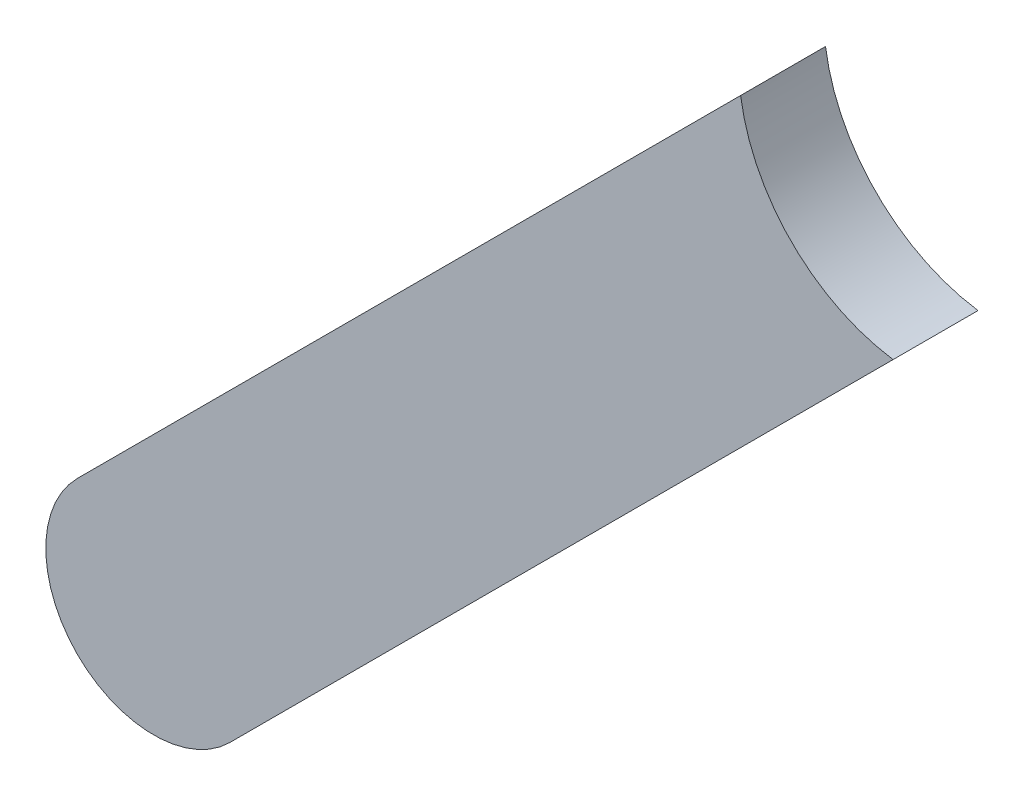
ISO-10303-21;
HEADER;
FILE_DESCRIPTION(('STEP AP214'),'2;1');
FILE_NAME('part.step','',(''),(''),'','','');
FILE_SCHEMA(('AUTOMOTIVE_DESIGN { 1 0 10303 214 1 1 1 1 }'));
ENDSEC;
DATA;
#1=APPLICATION_CONTEXT('core data for automotive mechanical design processes');
#2=APPLICATION_PROTOCOL_DEFINITION('international standard','automotive_design',2000,#1);
#3=PRODUCT_CONTEXT('',#1,'mechanical');
#4=PRODUCT('Part','Part','',(#3));
#5=PRODUCT_RELATED_PRODUCT_CATEGORY('part','',(#4));
#6=PRODUCT_DEFINITION_FORMATION('','',#4);
#7=PRODUCT_DEFINITION_CONTEXT('part definition',#1,'design');
#8=PRODUCT_DEFINITION('design','',#6,#7);
#9=PRODUCT_DEFINITION_SHAPE('','',#8);
#10=(LENGTH_UNIT() NAMED_UNIT(*) SI_UNIT(.MILLI.,.METRE.));
#11=(NAMED_UNIT(*) PLANE_ANGLE_UNIT() SI_UNIT($,.RADIAN.));
#12=(NAMED_UNIT(*) SI_UNIT($,.STERADIAN.) SOLID_ANGLE_UNIT());
#13=UNCERTAINTY_MEASURE_WITH_UNIT(LENGTH_MEASURE(1.E-05),#10,'distance_accuracy_value','');
#14=(GEOMETRIC_REPRESENTATION_CONTEXT(3) GLOBAL_UNCERTAINTY_ASSIGNED_CONTEXT((#13)) GLOBAL_UNIT_ASSIGNED_CONTEXT((#10,
#11,#12)) REPRESENTATION_CONTEXT('',''));
#15=CARTESIAN_POINT('',(0.,0.,0.));
#16=DIRECTION('',(0.,0.,1.));
#17=DIRECTION('',(1.,0.,0.));
#18=AXIS2_PLACEMENT_3D('',#15,#16,#17);
#19=CARTESIAN_POINT('',(132.48820594,53.64299406,0.));
#20=DIRECTION('',(-0.70710678118655,0.707106781186545,0.));
#21=DIRECTION('',(0.707106781186545,0.70710678118655,0.));
#22=AXIS2_PLACEMENT_3D('',#19,#20,#21);
#23=PLANE('',#22);
#24=DIRECTION('',(0.707106781186545,0.70710678118655,0.));
#25=VECTOR('',#24,1.);
#26=CARTESIAN_POINT('',(132.48820594,53.64299406,0.1999996));
#27=LINE('',#26,#25);
#28=CARTESIAN_POINT('',(132.48820594,53.64299406,0.1999996));
#29=VERTEX_POINT('',#28);
#30=CARTESIAN_POINT('',(134.05066116455,55.2054492845497,0.1999996));
#31=VERTEX_POINT('',#30);
#32=EDGE_CURVE('E11',#29,#31,#27,.T.);
#33=ORIENTED_EDGE('',*,*,#32,.F.);
#34=DIRECTION('',(0.,0.,1.));
#35=VECTOR('',#34,1.);
#36=CARTESIAN_POINT('',(132.48820594,53.64299406,0.));
#37=LINE('',#36,#35);
#38=CARTESIAN_POINT('',(132.48820594,53.64299406,0.));
#39=VERTEX_POINT('',#38);
#40=EDGE_CURVE('E24',#39,#29,#37,.T.);
#41=ORIENTED_EDGE('',*,*,#40,.F.);
#42=DIRECTION('',(0.707106781186545,0.70710678118655,0.));
#43=VECTOR('',#42,1.);
#44=CARTESIAN_POINT('',(132.48820594,53.64299406,0.));
#45=LINE('',#44,#43);
#46=CARTESIAN_POINT('',(134.05066116455,55.2054492845497,0.));
#47=VERTEX_POINT('',#46);
#48=EDGE_CURVE('E75',#39,#47,#45,.T.);
#49=ORIENTED_EDGE('',*,*,#48,.T.);
#50=DIRECTION('',(0.,0.,1.));
#51=VECTOR('',#50,1.);
#52=CARTESIAN_POINT('',(134.05066116455,55.2054492845497,0.));
#53=LINE('',#52,#51);
#54=EDGE_CURVE('E37',#47,#31,#53,.T.);
#55=ORIENTED_EDGE('',*,*,#54,.T.);
#56=EDGE_LOOP('',(#33,#41,#49,#55));
#57=FACE_BOUND('',#56,.T.);
#58=ADVANCED_FACE('F17',(#57),#23,.F.);
#59=CARTESIAN_POINT('',(134.112,55.626,0.));
#60=DIRECTION('',(0.,0.,-1.));
#61=DIRECTION('',(1.,0.,0.));
#62=AXIS2_PLACEMENT_3D('',#59,#60,#61);
#63=CYLINDRICAL_SURFACE('',#62,0.42500042);
#64=DIRECTION('',(0.,0.,1.));
#65=VECTOR('',#64,1.);
#66=CARTESIAN_POINT('',(133.69144928455,55.5646611645497,0.));
#67=LINE('',#66,#65);
#68=CARTESIAN_POINT('',(133.69144928455,55.5646611645497,0.));
#69=VERTEX_POINT('',#68);
#70=CARTESIAN_POINT('',(133.69144928455,55.5646611645497,0.1999996));
#71=VERTEX_POINT('',#70);
#72=EDGE_CURVE('E67',#69,#71,#67,.T.);
#73=ORIENTED_EDGE('',*,*,#72,.T.);
#74=CARTESIAN_POINT('',(134.112,55.626,0.1999996));
#75=DIRECTION('',(0.,0.,1.));
#76=DIRECTION('',(1.,0.,0.));
#77=AXIS2_PLACEMENT_3D('',#74,#75,#76);
#78=CIRCLE('',#77,0.42500042);
#79=EDGE_CURVE('E82',#71,#31,#78,.T.);
#80=ORIENTED_EDGE('',*,*,#79,.T.);
#81=ORIENTED_EDGE('',*,*,#54,.F.);
#82=CARTESIAN_POINT('',(134.112,55.626,0.));
#83=DIRECTION('',(0.,0.,1.));
#84=DIRECTION('',(1.,0.,0.));
#85=AXIS2_PLACEMENT_3D('',#82,#83,#84);
#86=CIRCLE('',#85,0.42500042);
#87=EDGE_CURVE('E80',#69,#47,#86,.T.);
#88=ORIENTED_EDGE('',*,*,#87,.F.);
#89=EDGE_LOOP('',(#73,#80,#81,#88));
#90=FACE_BOUND('',#89,.T.);
#91=ADVANCED_FACE('F88',(#90),#63,.F.);
#92=CARTESIAN_POINT('',(133.69144928455,55.5646611645497,0.));
#93=DIRECTION('',(0.70710678118655,-0.707106781186545,0.));
#94=DIRECTION('',(-0.707106781186545,-0.70710678118655,0.));
#95=AXIS2_PLACEMENT_3D('',#92,#93,#94);
#96=PLANE('',#95);
#97=DIRECTION('',(-0.707106781186545,-0.70710678118655,0.));
#98=VECTOR('',#97,1.);
#99=CARTESIAN_POINT('',(133.93239406,55.80560594,0.1999996));
#100=LINE('',#99,#98);
#101=CARTESIAN_POINT('',(132.12899406,54.00220594,0.1999996));
#102=VERTEX_POINT('',#101);
#103=EDGE_CURVE('E71',#71,#102,#100,.T.);
#104=ORIENTED_EDGE('',*,*,#103,.F.);
#105=ORIENTED_EDGE('',*,*,#72,.F.);
#106=DIRECTION('',(-0.707106781186545,-0.70710678118655,0.));
#107=VECTOR('',#106,1.);
#108=CARTESIAN_POINT('',(133.93239406,55.80560594,0.));
#109=LINE('',#108,#107);
#110=CARTESIAN_POINT('',(132.12899406,54.00220594,0.));
#111=VERTEX_POINT('',#110);
#112=EDGE_CURVE('E63',#69,#111,#109,.T.);
#113=ORIENTED_EDGE('',*,*,#112,.T.);
#114=DIRECTION('',(0.,0.,1.));
#115=VECTOR('',#114,1.);
#116=CARTESIAN_POINT('',(132.12899406,54.00220594,0.));
#117=LINE('',#116,#115);
#118=EDGE_CURVE('E53',#111,#102,#117,.T.);
#119=ORIENTED_EDGE('',*,*,#118,.T.);
#120=EDGE_LOOP('',(#104,#105,#113,#119));
#121=FACE_BOUND('',#120,.T.);
#122=ADVANCED_FACE('F66',(#121),#96,.F.);
#123=CARTESIAN_POINT('',(132.3086,53.8226,0.));
#124=DIRECTION('',(0.,0.,-1.));
#125=DIRECTION('',(-0.707106781186576,0.70710678118652,0.));
#126=AXIS2_PLACEMENT_3D('',#123,#124,#125);
#127=CYLINDRICAL_SURFACE('',#126,0.254001156230774);
#128=CARTESIAN_POINT('',(132.3086,53.8226,0.1999996));
#129=DIRECTION('',(0.,0.,1.));
#130=DIRECTION('',(-0.707106781186576,0.70710678118652,0.));
#131=AXIS2_PLACEMENT_3D('',#128,#129,#130);
#132=CIRCLE('',#131,0.254001156230774);
#133=EDGE_CURVE('E59',#102,#29,#132,.T.);
#134=ORIENTED_EDGE('',*,*,#133,.F.);
#135=ORIENTED_EDGE('',*,*,#118,.F.);
#136=CARTESIAN_POINT('',(132.3086,53.8226,0.));
#137=DIRECTION('',(0.,0.,1.));
#138=DIRECTION('',(-0.707106781186576,0.70710678118652,0.));
#139=AXIS2_PLACEMENT_3D('',#136,#137,#138);
#140=CIRCLE('',#139,0.254001156230774);
#141=EDGE_CURVE('E57',#111,#39,#140,.T.);
#142=ORIENTED_EDGE('',*,*,#141,.T.);
#143=ORIENTED_EDGE('',*,*,#40,.T.);
#144=EDGE_LOOP('',(#134,#135,#142,#143));
#145=FACE_BOUND('',#144,.T.);
#146=ADVANCED_FACE('F55',(#145),#127,.T.);
#147=CARTESIAN_POINT('',(132.48820594,53.64299406,0.));
#148=DIRECTION('',(0.,0.,-1.));
#149=DIRECTION('',(-1.,0.,0.));
#150=AXIS2_PLACEMENT_3D('',#147,#148,#149);
#151=PLANE('',#150);
#152=ORIENTED_EDGE('',*,*,#48,.F.);
#153=ORIENTED_EDGE('',*,*,#141,.F.);
#154=ORIENTED_EDGE('',*,*,#112,.F.);
#155=ORIENTED_EDGE('',*,*,#87,.T.);
#156=EDGE_LOOP('',(#152,#153,#154,#155));
#157=FACE_BOUND('',#156,.T.);
#158=ADVANCED_FACE('F74',(#157),#151,.T.);
#159=CARTESIAN_POINT('',(132.48820594,53.64299406,0.1999996));
#160=DIRECTION('',(0.,0.,-1.));
#161=DIRECTION('',(-1.,0.,0.));
#162=AXIS2_PLACEMENT_3D('',#159,#160,#161);
#163=PLANE('',#162);
#164=ORIENTED_EDGE('',*,*,#133,.T.);
#165=ORIENTED_EDGE('',*,*,#32,.T.);
#166=ORIENTED_EDGE('',*,*,#79,.F.);
#167=ORIENTED_EDGE('',*,*,#103,.T.);
#168=EDGE_LOOP('',(#164,#165,#166,#167));
#169=FACE_BOUND('',#168,.T.);
#170=ADVANCED_FACE('F91',(#169),#163,.F.);
#171=CLOSED_SHELL('',(#58,#91,#122,#146,#158,#170));
#172=MANIFOLD_SOLID_BREP('B1',#171);
#173=ADVANCED_BREP_SHAPE_REPRESENTATION('',(#18,#172),#14);
#174=SHAPE_DEFINITION_REPRESENTATION(#9,#173);
ENDSEC;
END-ISO-10303-21;
